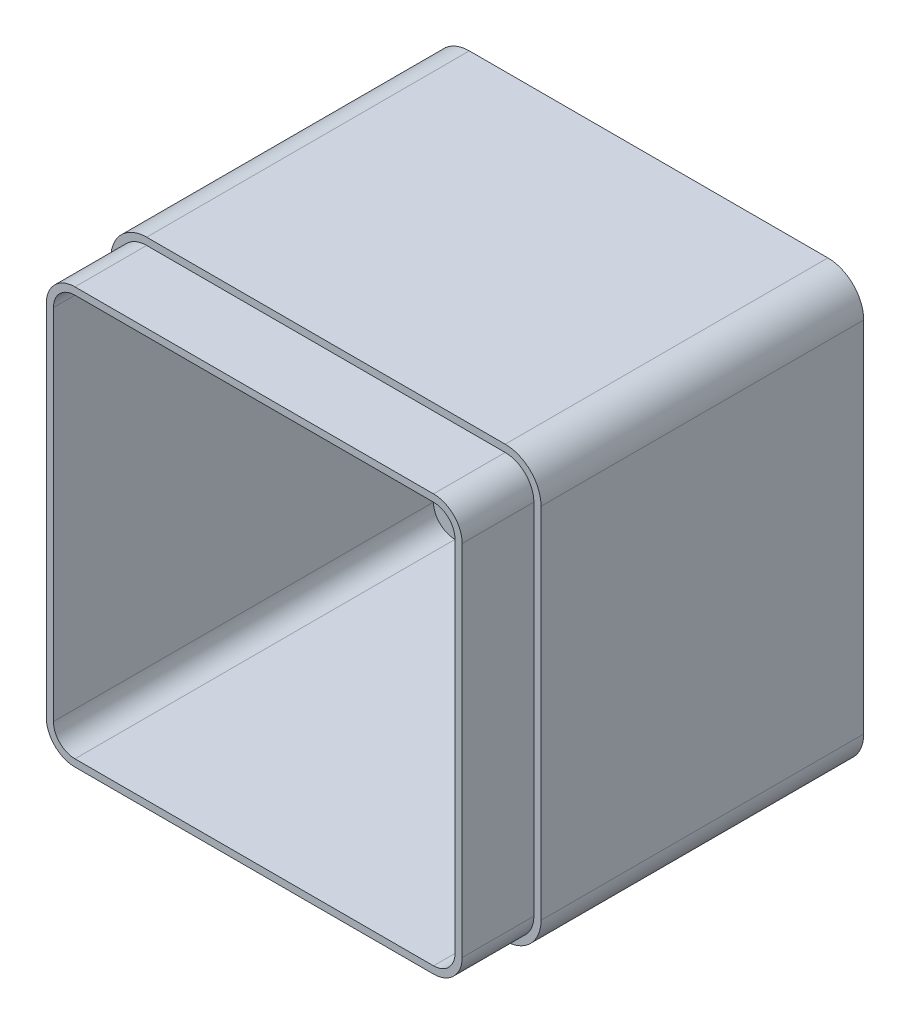
ISO-10303-21;
HEADER;
FILE_DESCRIPTION(('STEP AP214'),'2;1');
FILE_NAME('part.step','',(''),(''),'','','');
FILE_SCHEMA(('AUTOMOTIVE_DESIGN { 1 0 10303 214 1 1 1 1 }'));
ENDSEC;
DATA;
#1=APPLICATION_CONTEXT('core data for automotive mechanical design processes');
#2=APPLICATION_PROTOCOL_DEFINITION('international standard','automotive_design',2000,#1);
#3=PRODUCT_CONTEXT('',#1,'mechanical');
#4=PRODUCT('Part','Part','',(#3));
#5=PRODUCT_RELATED_PRODUCT_CATEGORY('part','',(#4));
#6=PRODUCT_DEFINITION_FORMATION('','',#4);
#7=PRODUCT_DEFINITION_CONTEXT('part definition',#1,'design');
#8=PRODUCT_DEFINITION('design','',#6,#7);
#9=PRODUCT_DEFINITION_SHAPE('','',#8);
#10=(LENGTH_UNIT() NAMED_UNIT(*) SI_UNIT(.MILLI.,.METRE.));
#11=(NAMED_UNIT(*) PLANE_ANGLE_UNIT() SI_UNIT($,.RADIAN.));
#12=(NAMED_UNIT(*) SI_UNIT($,.STERADIAN.) SOLID_ANGLE_UNIT());
#13=UNCERTAINTY_MEASURE_WITH_UNIT(LENGTH_MEASURE(1.E-05),#10,'distance_accuracy_value','');
#14=(GEOMETRIC_REPRESENTATION_CONTEXT(3) GLOBAL_UNCERTAINTY_ASSIGNED_CONTEXT((#13)) GLOBAL_UNIT_ASSIGNED_CONTEXT((#10,
#11,#12)) REPRESENTATION_CONTEXT('',''));
#15=CARTESIAN_POINT('',(0.,0.,0.));
#16=DIRECTION('',(0.,0.,1.));
#17=DIRECTION('',(1.,0.,0.));
#18=AXIS2_PLACEMENT_3D('',#15,#16,#17);
#19=CARTESIAN_POINT('',(0.,0.,90.));
#20=DIRECTION('',(0.,0.,-1.));
#21=DIRECTION('',(-1.,0.,0.));
#22=AXIS2_PLACEMENT_3D('',#19,#20,#21);
#23=PLANE('',#22);
#24=DIRECTION('',(0.,1.,0.));
#25=VECTOR('',#24,1.);
#26=CARTESIAN_POINT('',(0.,0.,90.));
#27=LINE('',#26,#25);
#28=CARTESIAN_POINT('',(0.,9.99999999999999,90.));
#29=VERTEX_POINT('',#28);
#30=CARTESIAN_POINT('',(0.,110.,90.));
#31=VERTEX_POINT('',#30);
#32=EDGE_CURVE('E431',#29,#31,#27,.T.);
#33=ORIENTED_EDGE('',*,*,#32,.F.);
#34=CARTESIAN_POINT('',(9.99999999999999,10.,90.));
#35=DIRECTION('',(0.,0.,-1.));
#36=DIRECTION('',(-1.,0.,0.));
#37=AXIS2_PLACEMENT_3D('',#34,#35,#36);
#38=CIRCLE('',#37,10.);
#39=CARTESIAN_POINT('',(9.99999999999999,0.,90.));
#40=VERTEX_POINT('',#39);
#41=EDGE_CURVE('E497',#29,#40,#38,.F.);
#42=ORIENTED_EDGE('',*,*,#41,.T.);
#43=DIRECTION('',(1.,0.,0.));
#44=VECTOR('',#43,1.);
#45=CARTESIAN_POINT('',(0.,0.,90.));
#46=LINE('',#45,#44);
#47=CARTESIAN_POINT('',(110.,0.,90.));
#48=VERTEX_POINT('',#47);
#49=EDGE_CURVE('E444',#40,#48,#46,.T.);
#50=ORIENTED_EDGE('',*,*,#49,.T.);
#51=CARTESIAN_POINT('',(110.,10.,90.));
#52=DIRECTION('',(0.,0.,-1.));
#53=DIRECTION('',(-1.,0.,0.));
#54=AXIS2_PLACEMENT_3D('',#51,#52,#53);
#55=CIRCLE('',#54,10.);
#56=CARTESIAN_POINT('',(120.,10.,90.));
#57=VERTEX_POINT('',#56);
#58=EDGE_CURVE('E494',#48,#57,#55,.F.);
#59=ORIENTED_EDGE('',*,*,#58,.T.);
#60=DIRECTION('',(0.,1.,0.));
#61=VECTOR('',#60,1.);
#62=CARTESIAN_POINT('',(120.,0.,90.));
#63=LINE('',#62,#61);
#64=CARTESIAN_POINT('',(120.,110.,90.));
#65=VERTEX_POINT('',#64);
#66=EDGE_CURVE('E440',#57,#65,#63,.T.);
#67=ORIENTED_EDGE('',*,*,#66,.T.);
#68=CARTESIAN_POINT('',(110.,110.,90.));
#69=DIRECTION('',(0.,0.,-1.));
#70=DIRECTION('',(-1.,0.,0.));
#71=AXIS2_PLACEMENT_3D('',#68,#69,#70);
#72=CIRCLE('',#71,10.);
#73=CARTESIAN_POINT('',(110.,120.,90.));
#74=VERTEX_POINT('',#73);
#75=EDGE_CURVE('E488',#65,#74,#72,.F.);
#76=ORIENTED_EDGE('',*,*,#75,.T.);
#77=DIRECTION('',(1.,0.,0.));
#78=VECTOR('',#77,1.);
#79=CARTESIAN_POINT('',(0.,120.,90.));
#80=LINE('',#79,#78);
#81=CARTESIAN_POINT('',(9.99999999999996,120.,90.));
#82=VERTEX_POINT('',#81);
#83=EDGE_CURVE('E435',#82,#74,#80,.T.);
#84=ORIENTED_EDGE('',*,*,#83,.F.);
#85=CARTESIAN_POINT('',(9.99999999999996,110.,90.));
#86=DIRECTION('',(0.,0.,-1.));
#87=DIRECTION('',(-1.,0.,0.));
#88=AXIS2_PLACEMENT_3D('',#85,#86,#87);
#89=CIRCLE('',#88,10.);
#90=EDGE_CURVE('E491',#82,#31,#89,.F.);
#91=ORIENTED_EDGE('',*,*,#90,.T.);
#92=EDGE_LOOP('',(#33,#42,#50,#59,#67,#76,#84,#91));
#93=FACE_BOUND('',#92,.T.);
#94=CARTESIAN_POINT('',(110.,110.,90.));
#95=DIRECTION('',(0.,0.,1.));
#96=DIRECTION('',(1.,0.,0.));
#97=AXIS2_PLACEMENT_3D('',#94,#95,#96);
#98=CIRCLE('',#97,7.99999999999999);
#99=CARTESIAN_POINT('',(118.,110.,90.));
#100=VERTEX_POINT('',#99);
#101=CARTESIAN_POINT('',(110.,118.,90.));
#102=VERTEX_POINT('',#101);
#103=EDGE_CURVE('E299',#100,#102,#98,.T.);
#104=ORIENTED_EDGE('',*,*,#103,.F.);
#105=DIRECTION('',(0.,1.,0.));
#106=VECTOR('',#105,1.);
#107=CARTESIAN_POINT('',(118.,10.,90.));
#108=LINE('',#107,#106);
#109=CARTESIAN_POINT('',(118.,10.,90.));
#110=VERTEX_POINT('',#109);
#111=EDGE_CURVE('E305',#110,#100,#108,.T.);
#112=ORIENTED_EDGE('',*,*,#111,.F.);
#113=CARTESIAN_POINT('',(110.,10.,90.));
#114=DIRECTION('',(0.,0.,1.));
#115=DIRECTION('',(1.,0.,0.));
#116=AXIS2_PLACEMENT_3D('',#113,#114,#115);
#117=CIRCLE('',#116,7.99999999999999);
#118=CARTESIAN_POINT('',(110.,2.,90.));
#119=VERTEX_POINT('',#118);
#120=EDGE_CURVE('E346',#119,#110,#117,.T.);
#121=ORIENTED_EDGE('',*,*,#120,.F.);
#122=DIRECTION('',(1.,0.,0.));
#123=VECTOR('',#122,1.);
#124=CARTESIAN_POINT('',(9.99999999999999,2.,90.));
#125=LINE('',#124,#123);
#126=CARTESIAN_POINT('',(9.99999999999999,2.,90.));
#127=VERTEX_POINT('',#126);
#128=EDGE_CURVE('E342',#127,#119,#125,.T.);
#129=ORIENTED_EDGE('',*,*,#128,.F.);
#130=CARTESIAN_POINT('',(9.99999999999999,10.,90.));
#131=DIRECTION('',(0.,0.,1.));
#132=DIRECTION('',(1.,0.,0.));
#133=AXIS2_PLACEMENT_3D('',#130,#131,#132);
#134=CIRCLE('',#133,8.);
#135=CARTESIAN_POINT('',(2.,10.,90.));
#136=VERTEX_POINT('',#135);
#137=EDGE_CURVE('E338',#136,#127,#134,.T.);
#138=ORIENTED_EDGE('',*,*,#137,.F.);
#139=DIRECTION('',(0.,-1.,0.));
#140=VECTOR('',#139,1.);
#141=CARTESIAN_POINT('',(1.99999999999996,110.,90.));
#142=LINE('',#141,#140);
#143=CARTESIAN_POINT('',(1.99999999999996,110.,90.));
#144=VERTEX_POINT('',#143);
#145=EDGE_CURVE('E334',#144,#136,#142,.T.);
#146=ORIENTED_EDGE('',*,*,#145,.F.);
#147=CARTESIAN_POINT('',(9.99999999999996,110.,90.));
#148=DIRECTION('',(0.,0.,1.));
#149=DIRECTION('',(1.,0.,0.));
#150=AXIS2_PLACEMENT_3D('',#147,#148,#149);
#151=CIRCLE('',#150,8.);
#152=CARTESIAN_POINT('',(9.99999999999995,118.,90.));
#153=VERTEX_POINT('',#152);
#154=EDGE_CURVE('E108',#153,#144,#151,.T.);
#155=ORIENTED_EDGE('',*,*,#154,.F.);
#156=DIRECTION('',(-1.,0.,0.));
#157=VECTOR('',#156,1.);
#158=CARTESIAN_POINT('',(110.,118.,90.));
#159=LINE('',#158,#157);
#160=EDGE_CURVE('E103',#102,#153,#159,.T.);
#161=ORIENTED_EDGE('',*,*,#160,.F.);
#162=EDGE_LOOP('',(#104,#112,#121,#129,#138,#146,#155,#161));
#163=FACE_BOUND('',#162,.T.);
#164=ADVANCED_FACE('F87',(#93,#163),#23,.F.);
#165=CARTESIAN_POINT('',(0.,0.,90.));
#166=DIRECTION('',(-1.,0.,0.));
#167=DIRECTION('',(0.,-1.,0.));
#168=AXIS2_PLACEMENT_3D('',#165,#166,#167);
#169=PLANE('',#168);
#170=DIRECTION('',(0.,1.,0.));
#171=VECTOR('',#170,1.);
#172=CARTESIAN_POINT('',(0.,0.,0.));
#173=LINE('',#172,#171);
#174=CARTESIAN_POINT('',(0.,9.99999999999999,0.));
#175=VERTEX_POINT('',#174);
#176=CARTESIAN_POINT('',(0.,110.,0.));
#177=VERTEX_POINT('',#176);
#178=EDGE_CURVE('E430',#175,#177,#173,.T.);
#179=ORIENTED_EDGE('',*,*,#178,.F.);
#180=DIRECTION('',(0.,0.,-1.));
#181=VECTOR('',#180,1.);
#182=CARTESIAN_POINT('',(0.,9.99999999999999,90.));
#183=LINE('',#182,#181);
#184=EDGE_CURVE('E485',#175,#29,#183,.F.);
#185=ORIENTED_EDGE('',*,*,#184,.T.);
#186=ORIENTED_EDGE('',*,*,#32,.T.);
#187=DIRECTION('',(0.,0.,-1.));
#188=VECTOR('',#187,1.);
#189=CARTESIAN_POINT('',(0.,110.,90.));
#190=LINE('',#189,#188);
#191=EDGE_CURVE('E481',#31,#177,#190,.T.);
#192=ORIENTED_EDGE('',*,*,#191,.T.);
#193=EDGE_LOOP('',(#179,#185,#186,#192));
#194=FACE_BOUND('',#193,.T.);
#195=ADVANCED_FACE('F526',(#194),#169,.T.);
#196=CARTESIAN_POINT('',(0.,0.,90.));
#197=DIRECTION('',(0.,1.,0.));
#198=DIRECTION('',(0.,0.,1.));
#199=AXIS2_PLACEMENT_3D('',#196,#197,#198);
#200=PLANE('',#199);
#201=ORIENTED_EDGE('',*,*,#49,.F.);
#202=DIRECTION('',(0.,0.,-1.));
#203=VECTOR('',#202,1.);
#204=CARTESIAN_POINT('',(9.99999999999999,0.,0.));
#205=LINE('',#204,#203);
#206=CARTESIAN_POINT('',(9.99999999999999,0.,0.));
#207=VERTEX_POINT('',#206);
#208=EDGE_CURVE('E465',#40,#207,#205,.T.);
#209=ORIENTED_EDGE('',*,*,#208,.T.);
#210=DIRECTION('',(1.,0.,0.));
#211=VECTOR('',#210,1.);
#212=CARTESIAN_POINT('',(0.,0.,0.));
#213=LINE('',#212,#211);
#214=CARTESIAN_POINT('',(110.,0.,0.));
#215=VERTEX_POINT('',#214);
#216=EDGE_CURVE('E436',#207,#215,#213,.T.);
#217=ORIENTED_EDGE('',*,*,#216,.T.);
#218=DIRECTION('',(0.,0.,-1.));
#219=VECTOR('',#218,1.);
#220=CARTESIAN_POINT('',(110.,0.,90.));
#221=LINE('',#220,#219);
#222=EDGE_CURVE('E448',#215,#48,#221,.F.);
#223=ORIENTED_EDGE('',*,*,#222,.T.);
#224=EDGE_LOOP('',(#201,#209,#217,#223));
#225=FACE_BOUND('',#224,.T.);
#226=ADVANCED_FACE('F536',(#225),#200,.F.);
#227=CARTESIAN_POINT('',(120.,0.,90.));
#228=DIRECTION('',(-1.,0.,0.));
#229=DIRECTION('',(0.,-1.,0.));
#230=AXIS2_PLACEMENT_3D('',#227,#228,#229);
#231=PLANE('',#230);
#232=ORIENTED_EDGE('',*,*,#66,.F.);
#233=DIRECTION('',(0.,0.,-1.));
#234=VECTOR('',#233,1.);
#235=CARTESIAN_POINT('',(120.,10.,90.));
#236=LINE('',#235,#234);
#237=CARTESIAN_POINT('',(120.,10.,0.));
#238=VERTEX_POINT('',#237);
#239=EDGE_CURVE('E503',#57,#238,#236,.T.);
#240=ORIENTED_EDGE('',*,*,#239,.T.);
#241=DIRECTION('',(0.,1.,0.));
#242=VECTOR('',#241,1.);
#243=CARTESIAN_POINT('',(120.,0.,0.));
#244=LINE('',#243,#242);
#245=CARTESIAN_POINT('',(120.,110.,0.));
#246=VERTEX_POINT('',#245);
#247=EDGE_CURVE('E456',#238,#246,#244,.T.);
#248=ORIENTED_EDGE('',*,*,#247,.T.);
#249=DIRECTION('',(0.,0.,-1.));
#250=VECTOR('',#249,1.);
#251=CARTESIAN_POINT('',(120.,110.,90.));
#252=LINE('',#251,#250);
#253=EDGE_CURVE('E500',#246,#65,#252,.F.);
#254=ORIENTED_EDGE('',*,*,#253,.T.);
#255=EDGE_LOOP('',(#232,#240,#248,#254));
#256=FACE_BOUND('',#255,.T.);
#257=ADVANCED_FACE('F544',(#256),#231,.F.);
#258=CARTESIAN_POINT('',(0.,120.,90.));
#259=DIRECTION('',(0.,1.,0.));
#260=DIRECTION('',(0.,0.,1.));
#261=AXIS2_PLACEMENT_3D('',#258,#259,#260);
#262=PLANE('',#261);
#263=DIRECTION('',(1.,0.,0.));
#264=VECTOR('',#263,1.);
#265=CARTESIAN_POINT('',(0.,120.,0.));
#266=LINE('',#265,#264);
#267=CARTESIAN_POINT('',(9.99999999999996,120.,0.));
#268=VERTEX_POINT('',#267);
#269=CARTESIAN_POINT('',(110.,120.,0.));
#270=VERTEX_POINT('',#269);
#271=EDGE_CURVE('E452',#268,#270,#266,.T.);
#272=ORIENTED_EDGE('',*,*,#271,.F.);
#273=DIRECTION('',(0.,0.,-1.));
#274=VECTOR('',#273,1.);
#275=CARTESIAN_POINT('',(9.99999999999996,120.,90.));
#276=LINE('',#275,#274);
#277=EDGE_CURVE('E12',#268,#82,#276,.F.);
#278=ORIENTED_EDGE('',*,*,#277,.T.);
#279=ORIENTED_EDGE('',*,*,#83,.T.);
#280=DIRECTION('',(0.,0.,-1.));
#281=VECTOR('',#280,1.);
#282=CARTESIAN_POINT('',(110.,120.,0.));
#283=LINE('',#282,#281);
#284=EDGE_CURVE('E96',#74,#270,#283,.T.);
#285=ORIENTED_EDGE('',*,*,#284,.T.);
#286=EDGE_LOOP('',(#272,#278,#279,#285));
#287=FACE_BOUND('',#286,.T.);
#288=ADVANCED_FACE('F511',(#287),#262,.T.);
#289=CARTESIAN_POINT('',(0.,0.,0.));
#290=DIRECTION('',(0.,0.,-1.));
#291=DIRECTION('',(-1.,0.,0.));
#292=AXIS2_PLACEMENT_3D('',#289,#290,#291);
#293=PLANE('',#292);
#294=ORIENTED_EDGE('',*,*,#216,.F.);
#295=CARTESIAN_POINT('',(9.99999999999999,10.,0.));
#296=DIRECTION('',(0.,0.,-1.));
#297=DIRECTION('',(-1.,0.,0.));
#298=AXIS2_PLACEMENT_3D('',#295,#296,#297);
#299=CIRCLE('',#298,10.);
#300=EDGE_CURVE('E478',#207,#175,#299,.T.);
#301=ORIENTED_EDGE('',*,*,#300,.T.);
#302=ORIENTED_EDGE('',*,*,#178,.T.);
#303=CARTESIAN_POINT('',(9.99999999999996,110.,0.));
#304=DIRECTION('',(0.,0.,-1.));
#305=DIRECTION('',(-1.,0.,0.));
#306=AXIS2_PLACEMENT_3D('',#303,#304,#305);
#307=CIRCLE('',#306,10.);
#308=EDGE_CURVE('E472',#177,#268,#307,.T.);
#309=ORIENTED_EDGE('',*,*,#308,.T.);
#310=ORIENTED_EDGE('',*,*,#271,.T.);
#311=CARTESIAN_POINT('',(110.,110.,0.));
#312=DIRECTION('',(0.,0.,-1.));
#313=DIRECTION('',(-1.,0.,0.));
#314=AXIS2_PLACEMENT_3D('',#311,#312,#313);
#315=CIRCLE('',#314,10.);
#316=EDGE_CURVE('E469',#270,#246,#315,.T.);
#317=ORIENTED_EDGE('',*,*,#316,.T.);
#318=ORIENTED_EDGE('',*,*,#247,.F.);
#319=CARTESIAN_POINT('',(110.,10.,0.));
#320=DIRECTION('',(0.,0.,-1.));
#321=DIRECTION('',(-1.,0.,0.));
#322=AXIS2_PLACEMENT_3D('',#319,#320,#321);
#323=CIRCLE('',#322,10.);
#324=EDGE_CURVE('E475',#238,#215,#323,.T.);
#325=ORIENTED_EDGE('',*,*,#324,.T.);
#326=EDGE_LOOP('',(#294,#301,#302,#309,#310,#317,#318,#325));
#327=FACE_BOUND('',#326,.T.);
#328=ADVANCED_FACE('F518',(#327),#293,.T.);
#329=CARTESIAN_POINT('',(9.99999999999999,10.,90.));
#330=DIRECTION('',(0.,0.,1.));
#331=DIRECTION('',(1.,0.,0.));
#332=AXIS2_PLACEMENT_3D('',#329,#330,#331);
#333=CYLINDRICAL_SURFACE('',#332,10.);
#334=ORIENTED_EDGE('',*,*,#41,.F.);
#335=ORIENTED_EDGE('',*,*,#184,.F.);
#336=ORIENTED_EDGE('',*,*,#300,.F.);
#337=ORIENTED_EDGE('',*,*,#208,.F.);
#338=EDGE_LOOP('',(#334,#335,#336,#337));
#339=FACE_BOUND('',#338,.T.);
#340=ADVANCED_FACE('F534',(#339),#333,.T.);
#341=CARTESIAN_POINT('',(110.,10.,90.));
#342=DIRECTION('',(0.,0.,-1.));
#343=DIRECTION('',(-1.,0.,0.));
#344=AXIS2_PLACEMENT_3D('',#341,#342,#343);
#345=CYLINDRICAL_SURFACE('',#344,10.);
#346=ORIENTED_EDGE('',*,*,#58,.F.);
#347=ORIENTED_EDGE('',*,*,#222,.F.);
#348=ORIENTED_EDGE('',*,*,#324,.F.);
#349=ORIENTED_EDGE('',*,*,#239,.F.);
#350=EDGE_LOOP('',(#346,#347,#348,#349));
#351=FACE_BOUND('',#350,.T.);
#352=ADVANCED_FACE('F541',(#351),#345,.T.);
#353=CARTESIAN_POINT('',(9.99999999999996,110.,90.));
#354=DIRECTION('',(0.,0.,-1.));
#355=DIRECTION('',(-1.,0.,0.));
#356=AXIS2_PLACEMENT_3D('',#353,#354,#355);
#357=CYLINDRICAL_SURFACE('',#356,10.);
#358=ORIENTED_EDGE('',*,*,#90,.F.);
#359=ORIENTED_EDGE('',*,*,#277,.F.);
#360=ORIENTED_EDGE('',*,*,#308,.F.);
#361=ORIENTED_EDGE('',*,*,#191,.F.);
#362=EDGE_LOOP('',(#358,#359,#360,#361));
#363=FACE_BOUND('',#362,.T.);
#364=ADVANCED_FACE('F524',(#363),#357,.T.);
#365=CARTESIAN_POINT('',(110.,110.,90.));
#366=DIRECTION('',(0.,0.,1.));
#367=DIRECTION('',(1.,0.,0.));
#368=AXIS2_PLACEMENT_3D('',#365,#366,#367);
#369=CYLINDRICAL_SURFACE('',#368,10.);
#370=ORIENTED_EDGE('',*,*,#75,.F.);
#371=ORIENTED_EDGE('',*,*,#253,.F.);
#372=ORIENTED_EDGE('',*,*,#316,.F.);
#373=ORIENTED_EDGE('',*,*,#284,.F.);
#374=EDGE_LOOP('',(#370,#371,#372,#373));
#375=FACE_BOUND('',#374,.T.);
#376=ADVANCED_FACE('F89',(#375),#369,.T.);
#377=CARTESIAN_POINT('',(110.,110.,110.));
#378=DIRECTION('',(0.,0.,-1.));
#379=DIRECTION('',(-1.,0.,0.));
#380=AXIS2_PLACEMENT_3D('',#377,#378,#379);
#381=CYLINDRICAL_SURFACE('',#380,7.99999999999999);
#382=ORIENTED_EDGE('',*,*,#103,.T.);
#383=DIRECTION('',(0.,0.,-1.));
#384=VECTOR('',#383,1.);
#385=CARTESIAN_POINT('',(110.,118.,110.));
#386=LINE('',#385,#384);
#387=CARTESIAN_POINT('',(110.,118.,110.));
#388=VERTEX_POINT('',#387);
#389=EDGE_CURVE('E380',#388,#102,#386,.T.);
#390=ORIENTED_EDGE('',*,*,#389,.F.);
#391=CARTESIAN_POINT('',(110.,110.,110.));
#392=DIRECTION('',(0.,0.,1.));
#393=DIRECTION('',(1.,0.,0.));
#394=AXIS2_PLACEMENT_3D('',#391,#392,#393);
#395=CIRCLE('',#394,7.99999999999999);
#396=CARTESIAN_POINT('',(118.,110.,110.));
#397=VERTEX_POINT('',#396);
#398=EDGE_CURVE('E300',#397,#388,#395,.T.);
#399=ORIENTED_EDGE('',*,*,#398,.F.);
#400=DIRECTION('',(0.,0.,-1.));
#401=VECTOR('',#400,1.);
#402=CARTESIAN_POINT('',(118.,110.,110.));
#403=LINE('',#402,#401);
#404=EDGE_CURVE('E326',#397,#100,#403,.T.);
#405=ORIENTED_EDGE('',*,*,#404,.T.);
#406=EDGE_LOOP('',(#382,#390,#399,#405));
#407=FACE_BOUND('',#406,.T.);
#408=ADVANCED_FACE('F547',(#407),#381,.T.);
#409=CARTESIAN_POINT('',(110.,118.,110.));
#410=DIRECTION('',(0.,-1.,0.));
#411=DIRECTION('',(0.,0.,-1.));
#412=AXIS2_PLACEMENT_3D('',#409,#410,#411);
#413=PLANE('',#412);
#414=ORIENTED_EDGE('',*,*,#160,.T.);
#415=DIRECTION('',(0.,0.,-1.));
#416=VECTOR('',#415,1.);
#417=CARTESIAN_POINT('',(9.99999999999995,118.,110.));
#418=LINE('',#417,#416);
#419=CARTESIAN_POINT('',(9.99999999999995,118.,110.));
#420=VERTEX_POINT('',#419);
#421=EDGE_CURVE('E376',#420,#153,#418,.T.);
#422=ORIENTED_EDGE('',*,*,#421,.F.);
#423=DIRECTION('',(-1.,0.,0.));
#424=VECTOR('',#423,1.);
#425=CARTESIAN_POINT('',(110.,118.,110.));
#426=LINE('',#425,#424);
#427=EDGE_CURVE('E304',#388,#420,#426,.T.);
#428=ORIENTED_EDGE('',*,*,#427,.F.);
#429=ORIENTED_EDGE('',*,*,#389,.T.);
#430=EDGE_LOOP('',(#414,#422,#428,#429));
#431=FACE_BOUND('',#430,.T.);
#432=ADVANCED_FACE('F552',(#431),#413,.F.);
#433=CARTESIAN_POINT('',(9.99999999999996,110.,110.));
#434=DIRECTION('',(0.,0.,-1.));
#435=DIRECTION('',(-1.,0.,0.));
#436=AXIS2_PLACEMENT_3D('',#433,#434,#435);
#437=CYLINDRICAL_SURFACE('',#436,8.);
#438=ORIENTED_EDGE('',*,*,#154,.T.);
#439=DIRECTION('',(0.,0.,-1.));
#440=VECTOR('',#439,1.);
#441=CARTESIAN_POINT('',(1.99999999999996,110.,110.));
#442=LINE('',#441,#440);
#443=CARTESIAN_POINT('',(1.99999999999996,110.,110.));
#444=VERTEX_POINT('',#443);
#445=EDGE_CURVE('E372',#444,#144,#442,.T.);
#446=ORIENTED_EDGE('',*,*,#445,.F.);
#447=CARTESIAN_POINT('',(9.99999999999996,110.,110.));
#448=DIRECTION('',(0.,0.,1.));
#449=DIRECTION('',(1.,0.,0.));
#450=AXIS2_PLACEMENT_3D('',#447,#448,#449);
#451=CIRCLE('',#450,8.);
#452=EDGE_CURVE('E308',#420,#444,#451,.T.);
#453=ORIENTED_EDGE('',*,*,#452,.F.);
#454=ORIENTED_EDGE('',*,*,#421,.T.);
#455=EDGE_LOOP('',(#438,#446,#453,#454));
#456=FACE_BOUND('',#455,.T.);
#457=ADVANCED_FACE('F623',(#456),#437,.T.);
#458=CARTESIAN_POINT('',(1.99999999999996,110.,110.));
#459=DIRECTION('',(1.,0.,0.));
#460=DIRECTION('',(0.,1.,0.));
#461=AXIS2_PLACEMENT_3D('',#458,#459,#460);
#462=PLANE('',#461);
#463=ORIENTED_EDGE('',*,*,#145,.T.);
#464=DIRECTION('',(0.,0.,-1.));
#465=VECTOR('',#464,1.);
#466=CARTESIAN_POINT('',(2.,9.99999999999999,110.));
#467=LINE('',#466,#465);
#468=CARTESIAN_POINT('',(2.,9.99999999999999,110.));
#469=VERTEX_POINT('',#468);
#470=EDGE_CURVE('E368',#469,#136,#467,.T.);
#471=ORIENTED_EDGE('',*,*,#470,.F.);
#472=DIRECTION('',(0.,-1.,0.));
#473=VECTOR('',#472,1.);
#474=CARTESIAN_POINT('',(1.99999999999996,110.,110.));
#475=LINE('',#474,#473);
#476=EDGE_CURVE('E311',#444,#469,#475,.T.);
#477=ORIENTED_EDGE('',*,*,#476,.F.);
#478=ORIENTED_EDGE('',*,*,#445,.T.);
#479=EDGE_LOOP('',(#463,#471,#477,#478));
#480=FACE_BOUND('',#479,.T.);
#481=ADVANCED_FACE('F633',(#480),#462,.F.);
#482=CARTESIAN_POINT('',(9.99999999999999,10.,110.));
#483=DIRECTION('',(0.,0.,-1.));
#484=DIRECTION('',(-1.,0.,0.));
#485=AXIS2_PLACEMENT_3D('',#482,#483,#484);
#486=CYLINDRICAL_SURFACE('',#485,8.);
#487=ORIENTED_EDGE('',*,*,#137,.T.);
#488=DIRECTION('',(0.,0.,-1.));
#489=VECTOR('',#488,1.);
#490=CARTESIAN_POINT('',(9.99999999999999,2.,110.));
#491=LINE('',#490,#489);
#492=CARTESIAN_POINT('',(9.99999999999999,2.,110.));
#493=VERTEX_POINT('',#492);
#494=EDGE_CURVE('E364',#493,#127,#491,.T.);
#495=ORIENTED_EDGE('',*,*,#494,.F.);
#496=CARTESIAN_POINT('',(9.99999999999999,10.,110.));
#497=DIRECTION('',(0.,0.,1.));
#498=DIRECTION('',(1.,0.,0.));
#499=AXIS2_PLACEMENT_3D('',#496,#497,#498);
#500=CIRCLE('',#499,8.);
#501=EDGE_CURVE('E314',#469,#493,#500,.T.);
#502=ORIENTED_EDGE('',*,*,#501,.F.);
#503=ORIENTED_EDGE('',*,*,#470,.T.);
#504=EDGE_LOOP('',(#487,#495,#502,#503));
#505=FACE_BOUND('',#504,.T.);
#506=ADVANCED_FACE('F643',(#505),#486,.T.);
#507=CARTESIAN_POINT('',(9.99999999999999,2.,110.));
#508=DIRECTION('',(0.,1.,0.));
#509=DIRECTION('',(0.,0.,1.));
#510=AXIS2_PLACEMENT_3D('',#507,#508,#509);
#511=PLANE('',#510);
#512=ORIENTED_EDGE('',*,*,#128,.T.);
#513=DIRECTION('',(0.,0.,-1.));
#514=VECTOR('',#513,1.);
#515=CARTESIAN_POINT('',(110.,2.,110.));
#516=LINE('',#515,#514);
#517=CARTESIAN_POINT('',(110.,2.,110.));
#518=VERTEX_POINT('',#517);
#519=EDGE_CURVE('E360',#518,#119,#516,.T.);
#520=ORIENTED_EDGE('',*,*,#519,.F.);
#521=DIRECTION('',(1.,0.,0.));
#522=VECTOR('',#521,1.);
#523=CARTESIAN_POINT('',(9.99999999999999,2.,110.));
#524=LINE('',#523,#522);
#525=EDGE_CURVE('E317',#493,#518,#524,.T.);
#526=ORIENTED_EDGE('',*,*,#525,.F.);
#527=ORIENTED_EDGE('',*,*,#494,.T.);
#528=EDGE_LOOP('',(#512,#520,#526,#527));
#529=FACE_BOUND('',#528,.T.);
#530=ADVANCED_FACE('F653',(#529),#511,.F.);
#531=CARTESIAN_POINT('',(110.,10.,110.));
#532=DIRECTION('',(0.,0.,-1.));
#533=DIRECTION('',(-1.,0.,0.));
#534=AXIS2_PLACEMENT_3D('',#531,#532,#533);
#535=CYLINDRICAL_SURFACE('',#534,7.99999999999999);
#536=ORIENTED_EDGE('',*,*,#120,.T.);
#537=DIRECTION('',(0.,0.,-1.));
#538=VECTOR('',#537,1.);
#539=CARTESIAN_POINT('',(118.,10.,110.));
#540=LINE('',#539,#538);
#541=CARTESIAN_POINT('',(118.,10.,110.));
#542=VERTEX_POINT('',#541);
#543=EDGE_CURVE('E356',#542,#110,#540,.T.);
#544=ORIENTED_EDGE('',*,*,#543,.F.);
#545=CARTESIAN_POINT('',(110.,10.,110.));
#546=DIRECTION('',(0.,0.,1.));
#547=DIRECTION('',(1.,0.,0.));
#548=AXIS2_PLACEMENT_3D('',#545,#546,#547);
#549=CIRCLE('',#548,7.99999999999999);
#550=EDGE_CURVE('E320',#518,#542,#549,.T.);
#551=ORIENTED_EDGE('',*,*,#550,.F.);
#552=ORIENTED_EDGE('',*,*,#519,.T.);
#553=EDGE_LOOP('',(#536,#544,#551,#552));
#554=FACE_BOUND('',#553,.T.);
#555=ADVANCED_FACE('F663',(#554),#535,.T.);
#556=CARTESIAN_POINT('',(118.,10.,110.));
#557=DIRECTION('',(-1.,0.,0.));
#558=DIRECTION('',(0.,-1.,0.));
#559=AXIS2_PLACEMENT_3D('',#556,#557,#558);
#560=PLANE('',#559);
#561=ORIENTED_EDGE('',*,*,#111,.T.);
#562=ORIENTED_EDGE('',*,*,#404,.F.);
#563=DIRECTION('',(0.,1.,0.));
#564=VECTOR('',#563,1.);
#565=CARTESIAN_POINT('',(118.,10.,110.));
#566=LINE('',#565,#564);
#567=EDGE_CURVE('E323',#542,#397,#566,.T.);
#568=ORIENTED_EDGE('',*,*,#567,.F.);
#569=ORIENTED_EDGE('',*,*,#543,.T.);
#570=EDGE_LOOP('',(#561,#562,#568,#569));
#571=FACE_BOUND('',#570,.T.);
#572=ADVANCED_FACE('F673',(#571),#560,.F.);
#573=CARTESIAN_POINT('',(110.,110.,110.));
#574=DIRECTION('',(0.,0.,1.));
#575=DIRECTION('',(1.,0.,0.));
#576=AXIS2_PLACEMENT_3D('',#573,#574,#575);
#577=PLANE('',#576);
#578=CARTESIAN_POINT('',(9.99999999999999,10.,110.));
#579=DIRECTION('',(0.,0.,1.));
#580=DIRECTION('',(1.,0.,0.));
#581=AXIS2_PLACEMENT_3D('',#578,#579,#580);
#582=CIRCLE('',#581,6.);
#583=CARTESIAN_POINT('',(9.99999999999999,4.,110.));
#584=VERTEX_POINT('',#583);
#585=CARTESIAN_POINT('',(4.,10.,110.));
#586=VERTEX_POINT('',#585);
#587=EDGE_CURVE('E262',#584,#586,#582,.F.);
#588=ORIENTED_EDGE('',*,*,#587,.T.);
#589=DIRECTION('',(0.,1.,0.));
#590=VECTOR('',#589,1.);
#591=CARTESIAN_POINT('',(4.,0.,110.));
#592=LINE('',#591,#590);
#593=CARTESIAN_POINT('',(3.99999999999996,110.,110.));
#594=VERTEX_POINT('',#593);
#595=EDGE_CURVE('E296',#586,#594,#592,.T.);
#596=ORIENTED_EDGE('',*,*,#595,.T.);
#597=CARTESIAN_POINT('',(9.99999999999996,110.,110.));
#598=DIRECTION('',(0.,0.,1.));
#599=DIRECTION('',(1.,0.,0.));
#600=AXIS2_PLACEMENT_3D('',#597,#598,#599);
#601=CIRCLE('',#600,6.);
#602=CARTESIAN_POINT('',(9.99999999999996,116.,110.));
#603=VERTEX_POINT('',#602);
#604=EDGE_CURVE('E292',#594,#603,#601,.F.);
#605=ORIENTED_EDGE('',*,*,#604,.T.);
#606=DIRECTION('',(1.,0.,0.));
#607=VECTOR('',#606,1.);
#608=CARTESIAN_POINT('',(0.,116.,110.));
#609=LINE('',#608,#607);
#610=CARTESIAN_POINT('',(110.,116.,110.));
#611=VERTEX_POINT('',#610);
#612=EDGE_CURVE('E288',#603,#611,#609,.T.);
#613=ORIENTED_EDGE('',*,*,#612,.T.);
#614=CARTESIAN_POINT('',(110.,110.,110.));
#615=DIRECTION('',(0.,0.,1.));
#616=DIRECTION('',(1.,0.,0.));
#617=AXIS2_PLACEMENT_3D('',#614,#615,#616);
#618=CIRCLE('',#617,6.);
#619=CARTESIAN_POINT('',(116.,110.,110.));
#620=VERTEX_POINT('',#619);
#621=EDGE_CURVE('E284',#611,#620,#618,.F.);
#622=ORIENTED_EDGE('',*,*,#621,.T.);
#623=DIRECTION('',(0.,-1.,0.));
#624=VECTOR('',#623,1.);
#625=CARTESIAN_POINT('',(116.,0.,110.));
#626=LINE('',#625,#624);
#627=CARTESIAN_POINT('',(116.,10.,110.));
#628=VERTEX_POINT('',#627);
#629=EDGE_CURVE('E279',#620,#628,#626,.T.);
#630=ORIENTED_EDGE('',*,*,#629,.T.);
#631=CARTESIAN_POINT('',(110.,10.,110.));
#632=DIRECTION('',(0.,0.,1.));
#633=DIRECTION('',(1.,0.,0.));
#634=AXIS2_PLACEMENT_3D('',#631,#632,#633);
#635=CIRCLE('',#634,6.);
#636=CARTESIAN_POINT('',(110.,4.,110.));
#637=VERTEX_POINT('',#636);
#638=EDGE_CURVE('E275',#628,#637,#635,.F.);
#639=ORIENTED_EDGE('',*,*,#638,.T.);
#640=DIRECTION('',(-1.,0.,0.));
#641=VECTOR('',#640,1.);
#642=CARTESIAN_POINT('',(0.,4.,110.));
#643=LINE('',#642,#641);
#644=EDGE_CURVE('E252',#637,#584,#643,.T.);
#645=ORIENTED_EDGE('',*,*,#644,.T.);
#646=EDGE_LOOP('',(#588,#596,#605,#613,#622,#630,#639,#645));
#647=FACE_BOUND('',#646,.T.);
#648=ORIENTED_EDGE('',*,*,#398,.T.);
#649=ORIENTED_EDGE('',*,*,#427,.T.);
#650=ORIENTED_EDGE('',*,*,#452,.T.);
#651=ORIENTED_EDGE('',*,*,#476,.T.);
#652=ORIENTED_EDGE('',*,*,#501,.T.);
#653=ORIENTED_EDGE('',*,*,#525,.T.);
#654=ORIENTED_EDGE('',*,*,#550,.T.);
#655=ORIENTED_EDGE('',*,*,#567,.T.);
#656=EDGE_LOOP('',(#648,#649,#650,#651,#652,#653,#654,#655));
#657=FACE_BOUND('',#656,.T.);
#658=ADVANCED_FACE('F271',(#647,#657),#577,.T.);
#659=CARTESIAN_POINT('',(0.,0.,4.));
#660=DIRECTION('',(0.,0.,-1.));
#661=DIRECTION('',(-1.,0.,0.));
#662=AXIS2_PLACEMENT_3D('',#659,#660,#661);
#663=PLANE('',#662);
#664=DIRECTION('',(1.,0.,0.));
#665=VECTOR('',#664,1.);
#666=CARTESIAN_POINT('',(0.,4.,4.));
#667=LINE('',#666,#665);
#668=CARTESIAN_POINT('',(9.99999999999999,4.,4.));
#669=VERTEX_POINT('',#668);
#670=CARTESIAN_POINT('',(110.,4.,4.));
#671=VERTEX_POINT('',#670);
#672=EDGE_CURVE('E255',#669,#671,#667,.T.);
#673=ORIENTED_EDGE('',*,*,#672,.T.);
#674=CARTESIAN_POINT('',(110.,10.,4.));
#675=DIRECTION('',(0.,0.,-1.));
#676=DIRECTION('',(-1.,0.,0.));
#677=AXIS2_PLACEMENT_3D('',#674,#675,#676);
#678=CIRCLE('',#677,6.);
#679=CARTESIAN_POINT('',(116.,10.,4.));
#680=VERTEX_POINT('',#679);
#681=EDGE_CURVE('E401',#680,#671,#678,.T.);
#682=ORIENTED_EDGE('',*,*,#681,.F.);
#683=DIRECTION('',(0.,1.,0.));
#684=VECTOR('',#683,1.);
#685=CARTESIAN_POINT('',(116.,0.,4.));
#686=LINE('',#685,#684);
#687=CARTESIAN_POINT('',(116.,110.,4.));
#688=VERTEX_POINT('',#687);
#689=EDGE_CURVE('E398',#680,#688,#686,.T.);
#690=ORIENTED_EDGE('',*,*,#689,.T.);
#691=CARTESIAN_POINT('',(110.,110.,4.));
#692=DIRECTION('',(0.,0.,-1.));
#693=DIRECTION('',(-1.,0.,0.));
#694=AXIS2_PLACEMENT_3D('',#691,#692,#693);
#695=CIRCLE('',#694,6.);
#696=CARTESIAN_POINT('',(110.,116.,4.));
#697=VERTEX_POINT('',#696);
#698=EDGE_CURVE('E258',#697,#688,#695,.T.);
#699=ORIENTED_EDGE('',*,*,#698,.F.);
#700=DIRECTION('',(1.,0.,0.));
#701=VECTOR('',#700,1.);
#702=CARTESIAN_POINT('',(0.,116.,4.));
#703=LINE('',#702,#701);
#704=CARTESIAN_POINT('',(9.99999999999996,116.,4.));
#705=VERTEX_POINT('',#704);
#706=EDGE_CURVE('E387',#705,#697,#703,.T.);
#707=ORIENTED_EDGE('',*,*,#706,.F.);
#708=CARTESIAN_POINT('',(9.99999999999996,110.,4.));
#709=DIRECTION('',(0.,0.,-1.));
#710=DIRECTION('',(-1.,0.,0.));
#711=AXIS2_PLACEMENT_3D('',#708,#709,#710);
#712=CIRCLE('',#711,6.);
#713=CARTESIAN_POINT('',(3.99999999999996,110.,4.));
#714=VERTEX_POINT('',#713);
#715=EDGE_CURVE('E402',#714,#705,#712,.T.);
#716=ORIENTED_EDGE('',*,*,#715,.F.);
#717=DIRECTION('',(0.,1.,0.));
#718=VECTOR('',#717,1.);
#719=CARTESIAN_POINT('',(4.,0.,4.));
#720=LINE('',#719,#718);
#721=CARTESIAN_POINT('',(4.,10.,4.));
#722=VERTEX_POINT('',#721);
#723=EDGE_CURVE('E383',#722,#714,#720,.T.);
#724=ORIENTED_EDGE('',*,*,#723,.F.);
#725=CARTESIAN_POINT('',(9.99999999999999,10.,4.));
#726=DIRECTION('',(0.,0.,-1.));
#727=DIRECTION('',(-1.,0.,0.));
#728=AXIS2_PLACEMENT_3D('',#725,#726,#727);
#729=CIRCLE('',#728,6.);
#730=EDGE_CURVE('E395',#669,#722,#729,.T.);
#731=ORIENTED_EDGE('',*,*,#730,.F.);
#732=EDGE_LOOP('',(#673,#682,#690,#699,#707,#716,#724,#731));
#733=FACE_BOUND('',#732,.T.);
#734=ADVANCED_FACE('F594',(#733),#663,.F.);
#735=CARTESIAN_POINT('',(9.99999999999999,10.,90.));
#736=DIRECTION('',(0.,0.,1.));
#737=DIRECTION('',(1.,0.,0.));
#738=AXIS2_PLACEMENT_3D('',#735,#736,#737);
#739=CYLINDRICAL_SURFACE('',#738,6.);
#740=DIRECTION('',(0.,0.,1.));
#741=VECTOR('',#740,1.);
#742=CARTESIAN_POINT('',(4.,10.,90.));
#743=LINE('',#742,#741);
#744=EDGE_CURVE('E265',#722,#586,#743,.T.);
#745=ORIENTED_EDGE('',*,*,#744,.T.);
#746=ORIENTED_EDGE('',*,*,#587,.F.);
#747=DIRECTION('',(0.,0.,1.));
#748=VECTOR('',#747,1.);
#749=CARTESIAN_POINT('',(9.99999999999999,4.,90.));
#750=LINE('',#749,#748);
#751=EDGE_CURVE('E247',#584,#669,#750,.F.);
#752=ORIENTED_EDGE('',*,*,#751,.T.);
#753=ORIENTED_EDGE('',*,*,#730,.T.);
#754=EDGE_LOOP('',(#745,#746,#752,#753));
#755=FACE_BOUND('',#754,.T.);
#756=ADVANCED_FACE('F263',(#755),#739,.F.);
#757=CARTESIAN_POINT('',(110.,10.,90.));
#758=DIRECTION('',(0.,0.,-1.));
#759=DIRECTION('',(-1.,0.,0.));
#760=AXIS2_PLACEMENT_3D('',#757,#758,#759);
#761=CYLINDRICAL_SURFACE('',#760,6.);
#762=DIRECTION('',(0.,0.,1.));
#763=VECTOR('',#762,1.);
#764=CARTESIAN_POINT('',(110.,4.,90.));
#765=LINE('',#764,#763);
#766=EDGE_CURVE('E259',#671,#637,#765,.T.);
#767=ORIENTED_EDGE('',*,*,#766,.T.);
#768=ORIENTED_EDGE('',*,*,#638,.F.);
#769=DIRECTION('',(0.,0.,1.));
#770=VECTOR('',#769,1.);
#771=CARTESIAN_POINT('',(116.,10.,90.));
#772=LINE('',#771,#770);
#773=EDGE_CURVE('E417',#628,#680,#772,.F.);
#774=ORIENTED_EDGE('',*,*,#773,.T.);
#775=ORIENTED_EDGE('',*,*,#681,.T.);
#776=EDGE_LOOP('',(#767,#768,#774,#775));
#777=FACE_BOUND('',#776,.T.);
#778=ADVANCED_FACE('F698',(#777),#761,.F.);
#779=CARTESIAN_POINT('',(9.99999999999996,110.,90.));
#780=DIRECTION('',(0.,0.,-1.));
#781=DIRECTION('',(-1.,0.,0.));
#782=AXIS2_PLACEMENT_3D('',#779,#780,#781);
#783=CYLINDRICAL_SURFACE('',#782,6.);
#784=DIRECTION('',(0.,0.,1.));
#785=VECTOR('',#784,1.);
#786=CARTESIAN_POINT('',(9.99999999999996,116.,90.));
#787=LINE('',#786,#785);
#788=EDGE_CURVE('E427',#705,#603,#787,.T.);
#789=ORIENTED_EDGE('',*,*,#788,.T.);
#790=ORIENTED_EDGE('',*,*,#604,.F.);
#791=DIRECTION('',(0.,0.,1.));
#792=VECTOR('',#791,1.);
#793=CARTESIAN_POINT('',(3.99999999999996,110.,90.));
#794=LINE('',#793,#792);
#795=EDGE_CURVE('E391',#594,#714,#794,.F.);
#796=ORIENTED_EDGE('',*,*,#795,.T.);
#797=ORIENTED_EDGE('',*,*,#715,.T.);
#798=EDGE_LOOP('',(#789,#790,#796,#797));
#799=FACE_BOUND('',#798,.T.);
#800=ADVANCED_FACE('F707',(#799),#783,.F.);
#801=CARTESIAN_POINT('',(110.,110.,90.));
#802=DIRECTION('',(0.,0.,1.));
#803=DIRECTION('',(1.,0.,0.));
#804=AXIS2_PLACEMENT_3D('',#801,#802,#803);
#805=CYLINDRICAL_SURFACE('',#804,6.);
#806=DIRECTION('',(0.,0.,1.));
#807=VECTOR('',#806,1.);
#808=CARTESIAN_POINT('',(116.,110.,90.));
#809=LINE('',#808,#807);
#810=EDGE_CURVE('E390',#688,#620,#809,.T.);
#811=ORIENTED_EDGE('',*,*,#810,.T.);
#812=ORIENTED_EDGE('',*,*,#621,.F.);
#813=DIRECTION('',(0.,0.,1.));
#814=VECTOR('',#813,1.);
#815=CARTESIAN_POINT('',(110.,116.,90.));
#816=LINE('',#815,#814);
#817=EDGE_CURVE('E421',#611,#697,#816,.F.);
#818=ORIENTED_EDGE('',*,*,#817,.T.);
#819=ORIENTED_EDGE('',*,*,#698,.T.);
#820=EDGE_LOOP('',(#811,#812,#818,#819));
#821=FACE_BOUND('',#820,.T.);
#822=ADVANCED_FACE('F563',(#821),#805,.F.);
#823=CARTESIAN_POINT('',(0.,116.,90.));
#824=DIRECTION('',(0.,1.,0.));
#825=DIRECTION('',(0.,0.,1.));
#826=AXIS2_PLACEMENT_3D('',#823,#824,#825);
#827=PLANE('',#826);
#828=ORIENTED_EDGE('',*,*,#706,.T.);
#829=ORIENTED_EDGE('',*,*,#817,.F.);
#830=ORIENTED_EDGE('',*,*,#612,.F.);
#831=ORIENTED_EDGE('',*,*,#788,.F.);
#832=EDGE_LOOP('',(#828,#829,#830,#831));
#833=FACE_BOUND('',#832,.T.);
#834=ADVANCED_FACE('F727',(#833),#827,.F.);
#835=CARTESIAN_POINT('',(116.,0.,90.));
#836=DIRECTION('',(-1.,0.,0.));
#837=DIRECTION('',(0.,-1.,0.));
#838=AXIS2_PLACEMENT_3D('',#835,#836,#837);
#839=PLANE('',#838);
#840=ORIENTED_EDGE('',*,*,#773,.F.);
#841=ORIENTED_EDGE('',*,*,#629,.F.);
#842=ORIENTED_EDGE('',*,*,#810,.F.);
#843=ORIENTED_EDGE('',*,*,#689,.F.);
#844=EDGE_LOOP('',(#840,#841,#842,#843));
#845=FACE_BOUND('',#844,.T.);
#846=ADVANCED_FACE('F736',(#845),#839,.T.);
#847=CARTESIAN_POINT('',(0.,4.,90.));
#848=DIRECTION('',(0.,1.,0.));
#849=DIRECTION('',(0.,0.,1.));
#850=AXIS2_PLACEMENT_3D('',#847,#848,#849);
#851=PLANE('',#850);
#852=ORIENTED_EDGE('',*,*,#751,.F.);
#853=ORIENTED_EDGE('',*,*,#644,.F.);
#854=ORIENTED_EDGE('',*,*,#766,.F.);
#855=ORIENTED_EDGE('',*,*,#672,.F.);
#856=EDGE_LOOP('',(#852,#853,#854,#855));
#857=FACE_BOUND('',#856,.T.);
#858=ADVANCED_FACE('F249',(#857),#851,.T.);
#859=CARTESIAN_POINT('',(4.,0.,90.));
#860=DIRECTION('',(-1.,0.,0.));
#861=DIRECTION('',(0.,-1.,0.));
#862=AXIS2_PLACEMENT_3D('',#859,#860,#861);
#863=PLANE('',#862);
#864=ORIENTED_EDGE('',*,*,#723,.T.);
#865=ORIENTED_EDGE('',*,*,#795,.F.);
#866=ORIENTED_EDGE('',*,*,#595,.F.);
#867=ORIENTED_EDGE('',*,*,#744,.F.);
#868=EDGE_LOOP('',(#864,#865,#866,#867));
#869=FACE_BOUND('',#868,.T.);
#870=ADVANCED_FACE('F756',(#869),#863,.F.);
#871=CLOSED_SHELL('',(#164,#195,#226,#257,#288,#328,#340,#352,#364,#376,#408,#432,#457,#481,
#506,#530,#555,#572,#658,#734,#756,#778,#800,#822,#834,#846,#858,#870));
#872=MANIFOLD_SOLID_BREP('B2',#871);
#873=ADVANCED_BREP_SHAPE_REPRESENTATION('',(#18,#872),#14);
#874=SHAPE_DEFINITION_REPRESENTATION(#9,#873);
ENDSEC;
END-ISO-10303-21;
